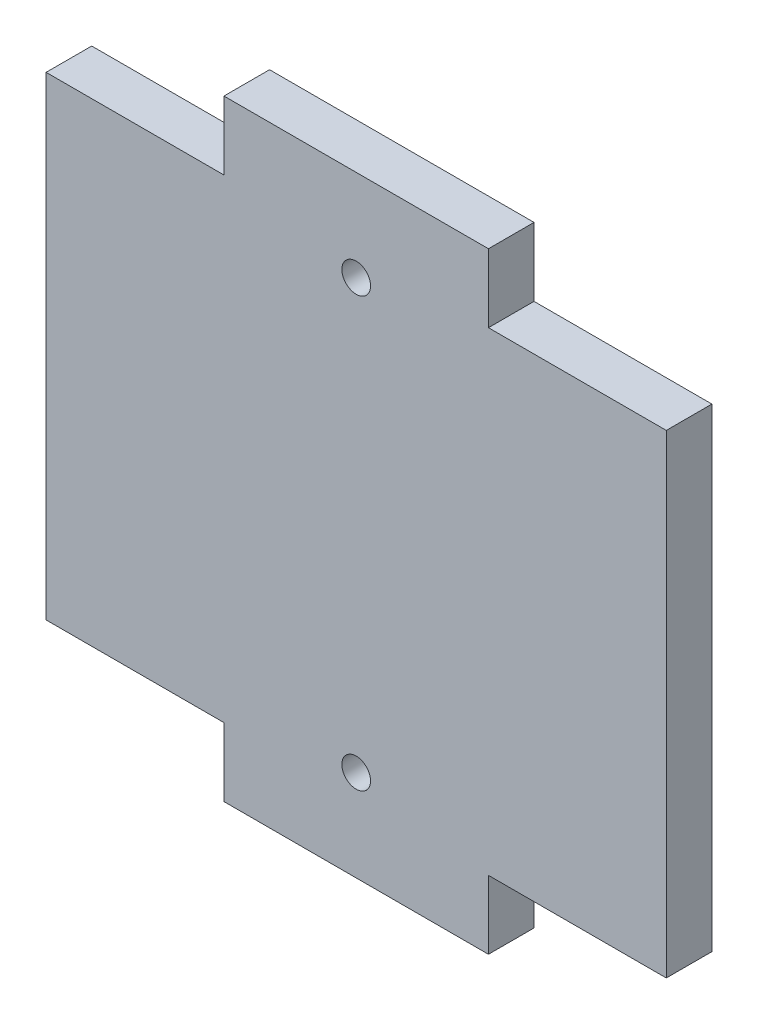
ISO-10303-21;
HEADER;
FILE_DESCRIPTION(('STEP AP214'),'2;1');
FILE_NAME('part.step','',(''),(''),'','','');
FILE_SCHEMA(('AUTOMOTIVE_DESIGN { 1 0 10303 214 1 1 1 1 }'));
ENDSEC;
DATA;
#1=APPLICATION_CONTEXT('core data for automotive mechanical design processes');
#2=APPLICATION_PROTOCOL_DEFINITION('international standard','automotive_design',2000,#1);
#3=PRODUCT_CONTEXT('',#1,'mechanical');
#4=PRODUCT('Part','Part','',(#3));
#5=PRODUCT_RELATED_PRODUCT_CATEGORY('part','',(#4));
#6=PRODUCT_DEFINITION_FORMATION('','',#4);
#7=PRODUCT_DEFINITION_CONTEXT('part definition',#1,'design');
#8=PRODUCT_DEFINITION('design','',#6,#7);
#9=PRODUCT_DEFINITION_SHAPE('','',#8);
#10=(LENGTH_UNIT() NAMED_UNIT(*) SI_UNIT(.MILLI.,.METRE.));
#11=(NAMED_UNIT(*) PLANE_ANGLE_UNIT() SI_UNIT($,.RADIAN.));
#12=(NAMED_UNIT(*) SI_UNIT($,.STERADIAN.) SOLID_ANGLE_UNIT());
#13=UNCERTAINTY_MEASURE_WITH_UNIT(LENGTH_MEASURE(1.E-05),#10,'distance_accuracy_value','');
#14=(GEOMETRIC_REPRESENTATION_CONTEXT(3) GLOBAL_UNCERTAINTY_ASSIGNED_CONTEXT((#13)) GLOBAL_UNIT_ASSIGNED_CONTEXT((#10,
#11,#12)) REPRESENTATION_CONTEXT('',''));
#15=CARTESIAN_POINT('',(0.,0.,0.));
#16=DIRECTION('',(0.,0.,1.));
#17=DIRECTION('',(1.,0.,0.));
#18=AXIS2_PLACEMENT_3D('',#15,#16,#17);
#19=CARTESIAN_POINT('',(-10.795,0.,1.5875));
#20=DIRECTION('',(-1.,0.,0.));
#21=DIRECTION('',(0.,0.,1.));
#22=AXIS2_PLACEMENT_3D('',#19,#20,#21);
#23=PLANE('',#22);
#24=DIRECTION('',(0.,1.,0.));
#25=VECTOR('',#24,1.);
#26=CARTESIAN_POINT('',(-10.795,0.,0.));
#27=LINE('',#26,#25);
#28=CARTESIAN_POINT('',(-10.795,-8.255,0.));
#29=VERTEX_POINT('',#28);
#30=CARTESIAN_POINT('',(-10.795,8.255,0.));
#31=VERTEX_POINT('',#30);
#32=EDGE_CURVE('E195',#29,#31,#27,.T.);
#33=ORIENTED_EDGE('',*,*,#32,.F.);
#34=DIRECTION('',(0.,0.,-1.));
#35=VECTOR('',#34,1.);
#36=CARTESIAN_POINT('',(-10.795,-8.255,1.5875));
#37=LINE('',#36,#35);
#38=CARTESIAN_POINT('',(-10.795,-8.255,1.5875));
#39=VERTEX_POINT('',#38);
#40=EDGE_CURVE('E11',#39,#29,#37,.T.);
#41=ORIENTED_EDGE('',*,*,#40,.F.);
#42=DIRECTION('',(0.,1.,0.));
#43=VECTOR('',#42,1.);
#44=CARTESIAN_POINT('',(-10.795,0.,1.5875));
#45=LINE('',#44,#43);
#46=CARTESIAN_POINT('',(-10.795,8.255,1.5875));
#47=VERTEX_POINT('',#46);
#48=EDGE_CURVE('E202',#39,#47,#45,.T.);
#49=ORIENTED_EDGE('',*,*,#48,.T.);
#50=DIRECTION('',(0.,0.,-1.));
#51=VECTOR('',#50,1.);
#52=CARTESIAN_POINT('',(-10.795,8.255,1.5875));
#53=LINE('',#52,#51);
#54=EDGE_CURVE('E248',#47,#31,#53,.T.);
#55=ORIENTED_EDGE('',*,*,#54,.T.);
#56=EDGE_LOOP('',(#33,#41,#49,#55));
#57=FACE_BOUND('',#56,.T.);
#58=ADVANCED_FACE('F41',(#57),#23,.T.);
#59=CARTESIAN_POINT('',(0.,-8.255,1.5875));
#60=DIRECTION('',(0.,-1.,0.));
#61=DIRECTION('',(0.,0.,-1.));
#62=AXIS2_PLACEMENT_3D('',#59,#60,#61);
#63=PLANE('',#62);
#64=DIRECTION('',(-1.,0.,0.));
#65=VECTOR('',#64,1.);
#66=CARTESIAN_POINT('',(0.,-8.255,0.));
#67=LINE('',#66,#65);
#68=CARTESIAN_POINT('',(-4.60375,-8.255,0.));
#69=VERTEX_POINT('',#68);
#70=EDGE_CURVE('E252',#69,#29,#67,.T.);
#71=ORIENTED_EDGE('',*,*,#70,.F.);
#72=DIRECTION('',(0.,0.,-1.));
#73=VECTOR('',#72,1.);
#74=CARTESIAN_POINT('',(-4.60375,-8.255,1.5875));
#75=LINE('',#74,#73);
#76=CARTESIAN_POINT('',(-4.60375,-8.255,1.5875));
#77=VERTEX_POINT('',#76);
#78=EDGE_CURVE('E49',#77,#69,#75,.T.);
#79=ORIENTED_EDGE('',*,*,#78,.F.);
#80=DIRECTION('',(-1.,0.,0.));
#81=VECTOR('',#80,1.);
#82=CARTESIAN_POINT('',(0.,-8.255,1.5875));
#83=LINE('',#82,#81);
#84=EDGE_CURVE('E206',#77,#39,#83,.T.);
#85=ORIENTED_EDGE('',*,*,#84,.T.);
#86=ORIENTED_EDGE('',*,*,#40,.T.);
#87=EDGE_LOOP('',(#71,#79,#85,#86));
#88=FACE_BOUND('',#87,.T.);
#89=ADVANCED_FACE('F338',(#88),#63,.T.);
#90=CARTESIAN_POINT('',(-4.60375,0.,1.5875));
#91=DIRECTION('',(1.,0.,0.));
#92=DIRECTION('',(0.,0.,-1.));
#93=AXIS2_PLACEMENT_3D('',#90,#91,#92);
#94=PLANE('',#93);
#95=DIRECTION('',(0.,-1.,0.));
#96=VECTOR('',#95,1.);
#97=CARTESIAN_POINT('',(-4.60375,0.,0.));
#98=LINE('',#97,#96);
#99=CARTESIAN_POINT('',(-4.60375,-10.63625,0.));
#100=VERTEX_POINT('',#99);
#101=EDGE_CURVE('E256',#69,#100,#98,.T.);
#102=ORIENTED_EDGE('',*,*,#101,.T.);
#103=DIRECTION('',(0.,0.,-1.));
#104=VECTOR('',#103,1.);
#105=CARTESIAN_POINT('',(-4.60375,-10.63625,1.5875));
#106=LINE('',#105,#104);
#107=CARTESIAN_POINT('',(-4.60375,-10.63625,1.5875));
#108=VERTEX_POINT('',#107);
#109=EDGE_CURVE('E322',#108,#100,#106,.T.);
#110=ORIENTED_EDGE('',*,*,#109,.F.);
#111=DIRECTION('',(0.,-1.,0.));
#112=VECTOR('',#111,1.);
#113=CARTESIAN_POINT('',(-4.60375,0.,1.5875));
#114=LINE('',#113,#112);
#115=EDGE_CURVE('E211',#77,#108,#114,.T.);
#116=ORIENTED_EDGE('',*,*,#115,.F.);
#117=ORIENTED_EDGE('',*,*,#78,.T.);
#118=EDGE_LOOP('',(#102,#110,#116,#117));
#119=FACE_BOUND('',#118,.T.);
#120=ADVANCED_FACE('F329',(#119),#94,.F.);
#121=CARTESIAN_POINT('',(0.,-10.63625,1.5875));
#122=DIRECTION('',(0.,1.,0.));
#123=DIRECTION('',(0.,0.,1.));
#124=AXIS2_PLACEMENT_3D('',#121,#122,#123);
#125=PLANE('',#124);
#126=DIRECTION('',(1.,0.,0.));
#127=VECTOR('',#126,1.);
#128=CARTESIAN_POINT('',(0.,-10.63625,0.));
#129=LINE('',#128,#127);
#130=CARTESIAN_POINT('',(4.60375,-10.63625,0.));
#131=VERTEX_POINT('',#130);
#132=EDGE_CURVE('E260',#100,#131,#129,.T.);
#133=ORIENTED_EDGE('',*,*,#132,.T.);
#134=DIRECTION('',(0.,0.,-1.));
#135=VECTOR('',#134,1.);
#136=CARTESIAN_POINT('',(4.60375,-10.63625,1.5875));
#137=LINE('',#136,#135);
#138=CARTESIAN_POINT('',(4.60375,-10.63625,1.5875));
#139=VERTEX_POINT('',#138);
#140=EDGE_CURVE('E319',#139,#131,#137,.T.);
#141=ORIENTED_EDGE('',*,*,#140,.F.);
#142=DIRECTION('',(1.,0.,0.));
#143=VECTOR('',#142,1.);
#144=CARTESIAN_POINT('',(0.,-10.63625,1.5875));
#145=LINE('',#144,#143);
#146=EDGE_CURVE('E215',#108,#139,#145,.T.);
#147=ORIENTED_EDGE('',*,*,#146,.F.);
#148=ORIENTED_EDGE('',*,*,#109,.T.);
#149=EDGE_LOOP('',(#133,#141,#147,#148));
#150=FACE_BOUND('',#149,.T.);
#151=ADVANCED_FACE('F407',(#150),#125,.F.);
#152=CARTESIAN_POINT('',(4.60375,0.,1.5875));
#153=DIRECTION('',(1.,0.,0.));
#154=DIRECTION('',(0.,0.,-1.));
#155=AXIS2_PLACEMENT_3D('',#152,#153,#154);
#156=PLANE('',#155);
#157=DIRECTION('',(0.,-1.,0.));
#158=VECTOR('',#157,1.);
#159=CARTESIAN_POINT('',(4.60375,0.,0.));
#160=LINE('',#159,#158);
#161=CARTESIAN_POINT('',(4.60375,-8.255,0.));
#162=VERTEX_POINT('',#161);
#163=EDGE_CURVE('E264',#162,#131,#160,.T.);
#164=ORIENTED_EDGE('',*,*,#163,.F.);
#165=DIRECTION('',(0.,0.,-1.));
#166=VECTOR('',#165,1.);
#167=CARTESIAN_POINT('',(4.60375,-8.255,1.5875));
#168=LINE('',#167,#166);
#169=CARTESIAN_POINT('',(4.60375,-8.255,1.5875));
#170=VERTEX_POINT('',#169);
#171=EDGE_CURVE('E316',#170,#162,#168,.T.);
#172=ORIENTED_EDGE('',*,*,#171,.F.);
#173=DIRECTION('',(0.,-1.,0.));
#174=VECTOR('',#173,1.);
#175=CARTESIAN_POINT('',(4.60375,0.,1.5875));
#176=LINE('',#175,#174);
#177=EDGE_CURVE('E218',#170,#139,#176,.T.);
#178=ORIENTED_EDGE('',*,*,#177,.T.);
#179=ORIENTED_EDGE('',*,*,#140,.T.);
#180=EDGE_LOOP('',(#164,#172,#178,#179));
#181=FACE_BOUND('',#180,.T.);
#182=ADVANCED_FACE('F411',(#181),#156,.T.);
#183=CARTESIAN_POINT('',(10.795,-8.255,0.));
#184=VERTEX_POINT('',#183);
#185=EDGE_CURVE('E257',#184,#162,#67,.T.);
#186=ORIENTED_EDGE('',*,*,#185,.F.);
#187=DIRECTION('',(0.,0.,-1.));
#188=VECTOR('',#187,1.);
#189=CARTESIAN_POINT('',(10.795,-8.255,1.5875));
#190=LINE('',#189,#188);
#191=CARTESIAN_POINT('',(10.795,-8.255,1.5875));
#192=VERTEX_POINT('',#191);
#193=EDGE_CURVE('E313',#192,#184,#190,.T.);
#194=ORIENTED_EDGE('',*,*,#193,.F.);
#195=EDGE_CURVE('E212',#192,#170,#83,.T.);
#196=ORIENTED_EDGE('',*,*,#195,.T.);
#197=ORIENTED_EDGE('',*,*,#171,.T.);
#198=EDGE_LOOP('',(#186,#194,#196,#197));
#199=FACE_BOUND('',#198,.T.);
#200=ADVANCED_FACE('F375',(#199),#63,.T.);
#201=CARTESIAN_POINT('',(10.795,0.,1.5875));
#202=DIRECTION('',(-1.,0.,0.));
#203=DIRECTION('',(0.,0.,1.));
#204=AXIS2_PLACEMENT_3D('',#201,#202,#203);
#205=PLANE('',#204);
#206=DIRECTION('',(0.,1.,0.));
#207=VECTOR('',#206,1.);
#208=CARTESIAN_POINT('',(10.795,0.,0.));
#209=LINE('',#208,#207);
#210=CARTESIAN_POINT('',(10.795,8.255,0.));
#211=VERTEX_POINT('',#210);
#212=EDGE_CURVE('E268',#184,#211,#209,.T.);
#213=ORIENTED_EDGE('',*,*,#212,.T.);
#214=DIRECTION('',(0.,0.,-1.));
#215=VECTOR('',#214,1.);
#216=CARTESIAN_POINT('',(10.795,8.255,1.5875));
#217=LINE('',#216,#215);
#218=CARTESIAN_POINT('',(10.795,8.255,1.5875));
#219=VERTEX_POINT('',#218);
#220=EDGE_CURVE('E309',#219,#211,#217,.T.);
#221=ORIENTED_EDGE('',*,*,#220,.F.);
#222=DIRECTION('',(0.,1.,0.));
#223=VECTOR('',#222,1.);
#224=CARTESIAN_POINT('',(10.795,0.,1.5875));
#225=LINE('',#224,#223);
#226=EDGE_CURVE('E222',#192,#219,#225,.T.);
#227=ORIENTED_EDGE('',*,*,#226,.F.);
#228=ORIENTED_EDGE('',*,*,#193,.T.);
#229=EDGE_LOOP('',(#213,#221,#227,#228));
#230=FACE_BOUND('',#229,.T.);
#231=ADVANCED_FACE('F370',(#230),#205,.F.);
#232=CARTESIAN_POINT('',(0.,8.255,1.5875));
#233=DIRECTION('',(0.,-1.,0.));
#234=DIRECTION('',(0.,0.,-1.));
#235=AXIS2_PLACEMENT_3D('',#232,#233,#234);
#236=PLANE('',#235);
#237=DIRECTION('',(-1.,0.,0.));
#238=VECTOR('',#237,1.);
#239=CARTESIAN_POINT('',(0.,8.255,0.));
#240=LINE('',#239,#238);
#241=CARTESIAN_POINT('',(4.60375,8.255,0.));
#242=VERTEX_POINT('',#241);
#243=EDGE_CURVE('E271',#211,#242,#240,.T.);
#244=ORIENTED_EDGE('',*,*,#243,.T.);
#245=DIRECTION('',(0.,0.,-1.));
#246=VECTOR('',#245,1.);
#247=CARTESIAN_POINT('',(4.60375,8.255,1.5875));
#248=LINE('',#247,#246);
#249=CARTESIAN_POINT('',(4.60375,8.255,1.5875));
#250=VERTEX_POINT('',#249);
#251=EDGE_CURVE('E305',#250,#242,#248,.T.);
#252=ORIENTED_EDGE('',*,*,#251,.F.);
#253=DIRECTION('',(-1.,0.,0.));
#254=VECTOR('',#253,1.);
#255=CARTESIAN_POINT('',(0.,8.255,1.5875));
#256=LINE('',#255,#254);
#257=EDGE_CURVE('E225',#219,#250,#256,.T.);
#258=ORIENTED_EDGE('',*,*,#257,.F.);
#259=ORIENTED_EDGE('',*,*,#220,.T.);
#260=EDGE_LOOP('',(#244,#252,#258,#259));
#261=FACE_BOUND('',#260,.T.);
#262=ADVANCED_FACE('F366',(#261),#236,.F.);
#263=CARTESIAN_POINT('',(4.60375,0.,1.5875));
#264=DIRECTION('',(-1.,0.,0.));
#265=DIRECTION('',(0.,0.,1.));
#266=AXIS2_PLACEMENT_3D('',#263,#264,#265);
#267=PLANE('',#266);
#268=DIRECTION('',(0.,1.,0.));
#269=VECTOR('',#268,1.);
#270=CARTESIAN_POINT('',(4.60375,0.,0.));
#271=LINE('',#270,#269);
#272=CARTESIAN_POINT('',(4.60375,10.63625,0.));
#273=VERTEX_POINT('',#272);
#274=EDGE_CURVE('E274',#242,#273,#271,.T.);
#275=ORIENTED_EDGE('',*,*,#274,.T.);
#276=DIRECTION('',(0.,0.,-1.));
#277=VECTOR('',#276,1.);
#278=CARTESIAN_POINT('',(4.60375,10.63625,1.5875));
#279=LINE('',#278,#277);
#280=CARTESIAN_POINT('',(4.60375,10.63625,1.5875));
#281=VERTEX_POINT('',#280);
#282=EDGE_CURVE('E302',#281,#273,#279,.T.);
#283=ORIENTED_EDGE('',*,*,#282,.F.);
#284=DIRECTION('',(0.,1.,0.));
#285=VECTOR('',#284,1.);
#286=CARTESIAN_POINT('',(4.60375,0.,1.5875));
#287=LINE('',#286,#285);
#288=EDGE_CURVE('E228',#250,#281,#287,.T.);
#289=ORIENTED_EDGE('',*,*,#288,.F.);
#290=ORIENTED_EDGE('',*,*,#251,.T.);
#291=EDGE_LOOP('',(#275,#283,#289,#290));
#292=FACE_BOUND('',#291,.T.);
#293=ADVANCED_FACE('F361',(#292),#267,.F.);
#294=CARTESIAN_POINT('',(0.,10.63625,1.5875));
#295=DIRECTION('',(0.,1.,0.));
#296=DIRECTION('',(0.,0.,1.));
#297=AXIS2_PLACEMENT_3D('',#294,#295,#296);
#298=PLANE('',#297);
#299=DIRECTION('',(1.,0.,0.));
#300=VECTOR('',#299,1.);
#301=CARTESIAN_POINT('',(0.,10.63625,0.));
#302=LINE('',#301,#300);
#303=CARTESIAN_POINT('',(-4.60375,10.63625,0.));
#304=VERTEX_POINT('',#303);
#305=EDGE_CURVE('E279',#304,#273,#302,.T.);
#306=ORIENTED_EDGE('',*,*,#305,.F.);
#307=DIRECTION('',(0.,0.,-1.));
#308=VECTOR('',#307,1.);
#309=CARTESIAN_POINT('',(-4.60375,10.63625,1.5875));
#310=LINE('',#309,#308);
#311=CARTESIAN_POINT('',(-4.60375,10.63625,1.5875));
#312=VERTEX_POINT('',#311);
#313=EDGE_CURVE('E299',#312,#304,#310,.T.);
#314=ORIENTED_EDGE('',*,*,#313,.F.);
#315=DIRECTION('',(1.,0.,0.));
#316=VECTOR('',#315,1.);
#317=CARTESIAN_POINT('',(0.,10.63625,1.5875));
#318=LINE('',#317,#316);
#319=EDGE_CURVE('E232',#312,#281,#318,.T.);
#320=ORIENTED_EDGE('',*,*,#319,.T.);
#321=ORIENTED_EDGE('',*,*,#282,.T.);
#322=EDGE_LOOP('',(#306,#314,#320,#321));
#323=FACE_BOUND('',#322,.T.);
#324=ADVANCED_FACE('F355',(#323),#298,.T.);
#325=CARTESIAN_POINT('',(-4.60375,0.,1.5875));
#326=DIRECTION('',(-1.,0.,0.));
#327=DIRECTION('',(0.,0.,1.));
#328=AXIS2_PLACEMENT_3D('',#325,#326,#327);
#329=PLANE('',#328);
#330=DIRECTION('',(0.,1.,0.));
#331=VECTOR('',#330,1.);
#332=CARTESIAN_POINT('',(-4.60375,0.,0.));
#333=LINE('',#332,#331);
#334=CARTESIAN_POINT('',(-4.60375,8.255,0.));
#335=VERTEX_POINT('',#334);
#336=EDGE_CURVE('E283',#335,#304,#333,.T.);
#337=ORIENTED_EDGE('',*,*,#336,.F.);
#338=DIRECTION('',(0.,0.,-1.));
#339=VECTOR('',#338,1.);
#340=CARTESIAN_POINT('',(-4.60375,8.255,1.5875));
#341=LINE('',#340,#339);
#342=CARTESIAN_POINT('',(-4.60375,8.255,1.5875));
#343=VERTEX_POINT('',#342);
#344=EDGE_CURVE('E296',#343,#335,#341,.T.);
#345=ORIENTED_EDGE('',*,*,#344,.F.);
#346=DIRECTION('',(0.,1.,0.));
#347=VECTOR('',#346,1.);
#348=CARTESIAN_POINT('',(-4.60375,0.,1.5875));
#349=LINE('',#348,#347);
#350=EDGE_CURVE('E236',#343,#312,#349,.T.);
#351=ORIENTED_EDGE('',*,*,#350,.T.);
#352=ORIENTED_EDGE('',*,*,#313,.T.);
#353=EDGE_LOOP('',(#337,#345,#351,#352));
#354=FACE_BOUND('',#353,.T.);
#355=ADVANCED_FACE('F349',(#354),#329,.T.);
#356=CARTESIAN_POINT('',(0.,7.46125,1.5875));
#357=DIRECTION('',(0.,0.,-1.));
#358=DIRECTION('',(-1.,0.,0.));
#359=AXIS2_PLACEMENT_3D('',#356,#357,#358);
#360=CYLINDRICAL_SURFACE('',#359,0.5);
#361=CARTESIAN_POINT('',(0.,7.46125,1.5875));
#362=DIRECTION('',(0.,0.,1.));
#363=DIRECTION('',(1.,0.,0.));
#364=AXIS2_PLACEMENT_3D('',#361,#362,#363);
#365=CIRCLE('',#364,0.5);
#366=CARTESIAN_POINT('',(0.5,7.46125,1.5875));
#367=VERTEX_POINT('',#366);
#368=EDGE_CURVE('E240',#367,#367,#365,.T.);
#369=ORIENTED_EDGE('',*,*,#368,.T.);
#370=EDGE_LOOP('',(#369));
#371=FACE_BOUND('',#370,.T.);
#372=CARTESIAN_POINT('',(0.,7.46125,0.));
#373=DIRECTION('',(0.,0.,1.));
#374=DIRECTION('',(1.,0.,0.));
#375=AXIS2_PLACEMENT_3D('',#372,#373,#374);
#376=CIRCLE('',#375,0.5);
#377=CARTESIAN_POINT('',(0.5,7.46125,0.));
#378=VERTEX_POINT('',#377);
#379=EDGE_CURVE('E287',#378,#378,#376,.T.);
#380=ORIENTED_EDGE('',*,*,#379,.F.);
#381=EDGE_LOOP('',(#380));
#382=FACE_BOUND('',#381,.T.);
#383=ADVANCED_FACE('F387',(#371,#382),#360,.F.);
#384=EDGE_CURVE('E275',#335,#31,#240,.T.);
#385=ORIENTED_EDGE('',*,*,#384,.T.);
#386=ORIENTED_EDGE('',*,*,#54,.F.);
#387=EDGE_CURVE('E229',#343,#47,#256,.T.);
#388=ORIENTED_EDGE('',*,*,#387,.F.);
#389=ORIENTED_EDGE('',*,*,#344,.T.);
#390=EDGE_LOOP('',(#385,#386,#388,#389));
#391=FACE_BOUND('',#390,.T.);
#392=ADVANCED_FACE('F384',(#391),#236,.F.);
#393=CARTESIAN_POINT('',(0.,-7.46125,1.5875));
#394=DIRECTION('',(0.,0.,-1.));
#395=DIRECTION('',(-1.,0.,0.));
#396=AXIS2_PLACEMENT_3D('',#393,#394,#395);
#397=CYLINDRICAL_SURFACE('',#396,0.5);
#398=CARTESIAN_POINT('',(0.,-7.46125,1.5875));
#399=DIRECTION('',(0.,0.,1.));
#400=DIRECTION('',(1.,0.,0.));
#401=AXIS2_PLACEMENT_3D('',#398,#399,#400);
#402=CIRCLE('',#401,0.5);
#403=CARTESIAN_POINT('',(0.499999999999998,-7.46125,1.5875));
#404=VERTEX_POINT('',#403);
#405=EDGE_CURVE('E244',#404,#404,#402,.F.);
#406=ORIENTED_EDGE('',*,*,#405,.F.);
#407=EDGE_LOOP('',(#406));
#408=FACE_BOUND('',#407,.T.);
#409=CARTESIAN_POINT('',(0.,-7.46125,0.));
#410=DIRECTION('',(0.,0.,1.));
#411=DIRECTION('',(1.,0.,0.));
#412=AXIS2_PLACEMENT_3D('',#409,#410,#411);
#413=CIRCLE('',#412,0.5);
#414=CARTESIAN_POINT('',(0.499999999999998,-7.46125,0.));
#415=VERTEX_POINT('',#414);
#416=EDGE_CURVE('E207',#415,#415,#413,.F.);
#417=ORIENTED_EDGE('',*,*,#416,.T.);
#418=EDGE_LOOP('',(#417));
#419=FACE_BOUND('',#418,.T.);
#420=ADVANCED_FACE('F386',(#408,#419),#397,.F.);
#421=CARTESIAN_POINT('',(0.,0.,1.5875));
#422=DIRECTION('',(0.,0.,1.));
#423=DIRECTION('',(1.,0.,0.));
#424=AXIS2_PLACEMENT_3D('',#421,#422,#423);
#425=PLANE('',#424);
#426=ORIENTED_EDGE('',*,*,#48,.F.);
#427=ORIENTED_EDGE('',*,*,#84,.F.);
#428=ORIENTED_EDGE('',*,*,#115,.T.);
#429=ORIENTED_EDGE('',*,*,#146,.T.);
#430=ORIENTED_EDGE('',*,*,#177,.F.);
#431=ORIENTED_EDGE('',*,*,#195,.F.);
#432=ORIENTED_EDGE('',*,*,#226,.T.);
#433=ORIENTED_EDGE('',*,*,#257,.T.);
#434=ORIENTED_EDGE('',*,*,#288,.T.);
#435=ORIENTED_EDGE('',*,*,#319,.F.);
#436=ORIENTED_EDGE('',*,*,#350,.F.);
#437=ORIENTED_EDGE('',*,*,#387,.T.);
#438=EDGE_LOOP('',(#426,#427,#428,#429,#430,#431,#432,#433,#434,#435,#436,#437));
#439=FACE_BOUND('',#438,.T.);
#440=ORIENTED_EDGE('',*,*,#368,.F.);
#441=EDGE_LOOP('',(#440));
#442=FACE_BOUND('',#441,.T.);
#443=ORIENTED_EDGE('',*,*,#405,.T.);
#444=EDGE_LOOP('',(#443));
#445=FACE_BOUND('',#444,.T.);
#446=ADVANCED_FACE('F382',(#439,#442,#445),#425,.T.);
#447=CARTESIAN_POINT('',(0.,0.,0.));
#448=DIRECTION('',(0.,0.,1.));
#449=DIRECTION('',(1.,0.,0.));
#450=AXIS2_PLACEMENT_3D('',#447,#448,#449);
#451=PLANE('',#450);
#452=DIRECTION('',(-1.,0.,0.));
#453=VECTOR('',#452,1.);
#454=CARTESIAN_POINT('',(7.62,-5.08,0.));
#455=LINE('',#454,#453);
#456=CARTESIAN_POINT('',(7.62,-5.08,0.));
#457=VERTEX_POINT('',#456);
#458=CARTESIAN_POINT('',(-7.62,-5.08,0.));
#459=VERTEX_POINT('',#458);
#460=EDGE_CURVE('E175',#457,#459,#455,.T.);
#461=ORIENTED_EDGE('',*,*,#460,.F.);
#462=DIRECTION('',(0.,1.,0.));
#463=VECTOR('',#462,1.);
#464=CARTESIAN_POINT('',(7.62,-5.08,0.));
#465=LINE('',#464,#463);
#466=CARTESIAN_POINT('',(7.62,5.08,0.));
#467=VERTEX_POINT('',#466);
#468=EDGE_CURVE('E56',#457,#467,#465,.T.);
#469=ORIENTED_EDGE('',*,*,#468,.T.);
#470=DIRECTION('',(-1.,0.,0.));
#471=VECTOR('',#470,1.);
#472=CARTESIAN_POINT('',(7.62,5.08,0.));
#473=LINE('',#472,#471);
#474=CARTESIAN_POINT('',(-7.62,5.08,0.));
#475=VERTEX_POINT('',#474);
#476=EDGE_CURVE('E61',#467,#475,#473,.T.);
#477=ORIENTED_EDGE('',*,*,#476,.T.);
#478=DIRECTION('',(0.,1.,0.));
#479=VECTOR('',#478,1.);
#480=CARTESIAN_POINT('',(-7.62,-5.08,0.));
#481=LINE('',#480,#479);
#482=EDGE_CURVE('E179',#459,#475,#481,.T.);
#483=ORIENTED_EDGE('',*,*,#482,.F.);
#484=EDGE_LOOP('',(#461,#469,#477,#483));
#485=FACE_BOUND('',#484,.T.);
#486=ORIENTED_EDGE('',*,*,#32,.T.);
#487=ORIENTED_EDGE('',*,*,#384,.F.);
#488=ORIENTED_EDGE('',*,*,#336,.T.);
#489=ORIENTED_EDGE('',*,*,#305,.T.);
#490=ORIENTED_EDGE('',*,*,#274,.F.);
#491=ORIENTED_EDGE('',*,*,#243,.F.);
#492=ORIENTED_EDGE('',*,*,#212,.F.);
#493=ORIENTED_EDGE('',*,*,#185,.T.);
#494=ORIENTED_EDGE('',*,*,#163,.T.);
#495=ORIENTED_EDGE('',*,*,#132,.F.);
#496=ORIENTED_EDGE('',*,*,#101,.F.);
#497=ORIENTED_EDGE('',*,*,#70,.T.);
#498=EDGE_LOOP('',(#486,#487,#488,#489,#490,#491,#492,#493,#494,#495,#496,#497));
#499=FACE_BOUND('',#498,.T.);
#500=ORIENTED_EDGE('',*,*,#379,.T.);
#501=EDGE_LOOP('',(#500));
#502=FACE_BOUND('',#501,.T.);
#503=ORIENTED_EDGE('',*,*,#416,.F.);
#504=EDGE_LOOP('',(#503));
#505=FACE_BOUND('',#504,.T.);
#506=ADVANCED_FACE('F336',(#485,#499,#502,#505),#451,.F.);
#507=CARTESIAN_POINT('',(7.62,-5.08,-3.175));
#508=DIRECTION('',(1.,0.,0.));
#509=DIRECTION('',(0.,0.,-1.));
#510=AXIS2_PLACEMENT_3D('',#507,#508,#509);
#511=PLANE('',#510);
#512=ORIENTED_EDGE('',*,*,#468,.F.);
#513=DIRECTION('',(0.,0.,1.));
#514=VECTOR('',#513,1.);
#515=CARTESIAN_POINT('',(7.62,-5.08,-3.175));
#516=LINE('',#515,#514);
#517=CARTESIAN_POINT('',(7.62,-5.08,-3.175));
#518=VERTEX_POINT('',#517);
#519=EDGE_CURVE('E172',#518,#457,#516,.T.);
#520=ORIENTED_EDGE('',*,*,#519,.F.);
#521=DIRECTION('',(0.,1.,0.));
#522=VECTOR('',#521,1.);
#523=CARTESIAN_POINT('',(7.62,-5.08,-3.175));
#524=LINE('',#523,#522);
#525=CARTESIAN_POINT('',(7.62,5.08,-3.175));
#526=VERTEX_POINT('',#525);
#527=EDGE_CURVE('E164',#518,#526,#524,.T.);
#528=ORIENTED_EDGE('',*,*,#527,.T.);
#529=DIRECTION('',(0.,0.,1.));
#530=VECTOR('',#529,1.);
#531=CARTESIAN_POINT('',(7.62,5.08,-3.175));
#532=LINE('',#531,#530);
#533=EDGE_CURVE('E151',#526,#467,#532,.T.);
#534=ORIENTED_EDGE('',*,*,#533,.T.);
#535=EDGE_LOOP('',(#512,#520,#528,#534));
#536=FACE_BOUND('',#535,.T.);
#537=ADVANCED_FACE('F170',(#536),#511,.T.);
#538=CARTESIAN_POINT('',(7.62,-5.08,-3.175));
#539=DIRECTION('',(0.,1.,0.));
#540=DIRECTION('',(-1.,0.,0.));
#541=AXIS2_PLACEMENT_3D('',#538,#539,#540);
#542=PLANE('',#541);
#543=ORIENTED_EDGE('',*,*,#460,.T.);
#544=DIRECTION('',(0.,0.,1.));
#545=VECTOR('',#544,1.);
#546=CARTESIAN_POINT('',(-7.62,-5.08,-3.175));
#547=LINE('',#546,#545);
#548=CARTESIAN_POINT('',(-7.62,-5.08,-3.175));
#549=VERTEX_POINT('',#548);
#550=EDGE_CURVE('E196',#549,#459,#547,.T.);
#551=ORIENTED_EDGE('',*,*,#550,.F.);
#552=DIRECTION('',(-1.,0.,0.));
#553=VECTOR('',#552,1.);
#554=CARTESIAN_POINT('',(7.62,-5.08,-3.175));
#555=LINE('',#554,#553);
#556=EDGE_CURVE('E159',#518,#549,#555,.T.);
#557=ORIENTED_EDGE('',*,*,#556,.F.);
#558=ORIENTED_EDGE('',*,*,#519,.T.);
#559=EDGE_LOOP('',(#543,#551,#557,#558));
#560=FACE_BOUND('',#559,.T.);
#561=ADVANCED_FACE('F541',(#560),#542,.F.);
#562=CARTESIAN_POINT('',(-7.62,-5.08,-3.175));
#563=DIRECTION('',(1.,0.,0.));
#564=DIRECTION('',(0.,0.,-1.));
#565=AXIS2_PLACEMENT_3D('',#562,#563,#564);
#566=PLANE('',#565);
#567=ORIENTED_EDGE('',*,*,#482,.T.);
#568=DIRECTION('',(0.,0.,1.));
#569=VECTOR('',#568,1.);
#570=CARTESIAN_POINT('',(-7.62,5.08,-3.175));
#571=LINE('',#570,#569);
#572=CARTESIAN_POINT('',(-7.62,5.08,-3.175));
#573=VERTEX_POINT('',#572);
#574=EDGE_CURVE('E158',#573,#475,#571,.T.);
#575=ORIENTED_EDGE('',*,*,#574,.F.);
#576=DIRECTION('',(0.,1.,0.));
#577=VECTOR('',#576,1.);
#578=CARTESIAN_POINT('',(-7.62,-5.08,-3.175));
#579=LINE('',#578,#577);
#580=EDGE_CURVE('E166',#549,#573,#579,.T.);
#581=ORIENTED_EDGE('',*,*,#580,.F.);
#582=ORIENTED_EDGE('',*,*,#550,.T.);
#583=EDGE_LOOP('',(#567,#575,#581,#582));
#584=FACE_BOUND('',#583,.T.);
#585=ADVANCED_FACE('F549',(#584),#566,.F.);
#586=CARTESIAN_POINT('',(7.62,5.08,-3.175));
#587=DIRECTION('',(0.,1.,0.));
#588=DIRECTION('',(-1.,0.,0.));
#589=AXIS2_PLACEMENT_3D('',#586,#587,#588);
#590=PLANE('',#589);
#591=ORIENTED_EDGE('',*,*,#476,.F.);
#592=ORIENTED_EDGE('',*,*,#533,.F.);
#593=DIRECTION('',(-1.,0.,0.));
#594=VECTOR('',#593,1.);
#595=CARTESIAN_POINT('',(7.62,5.08,-3.175));
#596=LINE('',#595,#594);
#597=EDGE_CURVE('E154',#526,#573,#596,.T.);
#598=ORIENTED_EDGE('',*,*,#597,.T.);
#599=ORIENTED_EDGE('',*,*,#574,.T.);
#600=EDGE_LOOP('',(#591,#592,#598,#599));
#601=FACE_BOUND('',#600,.T.);
#602=ADVANCED_FACE('F153',(#601),#590,.T.);
#603=CARTESIAN_POINT('',(0.,0.,-3.175));
#604=DIRECTION('',(0.,0.,1.));
#605=DIRECTION('',(1.,0.,0.));
#606=AXIS2_PLACEMENT_3D('',#603,#604,#605);
#607=PLANE('',#606);
#608=ORIENTED_EDGE('',*,*,#527,.F.);
#609=ORIENTED_EDGE('',*,*,#556,.T.);
#610=ORIENTED_EDGE('',*,*,#580,.T.);
#611=ORIENTED_EDGE('',*,*,#597,.F.);
#612=EDGE_LOOP('',(#608,#609,#610,#611));
#613=FACE_BOUND('',#612,.T.);
#614=ADVANCED_FACE('F163',(#613),#607,.F.);
#615=CLOSED_SHELL('',(#58,#89,#120,#151,#182,#200,#231,#262,#293,#324,#355,#383,#392,#420,#446,
#506,#537,#561,#585,#602,#614));
#616=MANIFOLD_SOLID_BREP('B2',#615);
#617=ADVANCED_BREP_SHAPE_REPRESENTATION('',(#18,#616),#14);
#618=SHAPE_DEFINITION_REPRESENTATION(#9,#617);
ENDSEC;
END-ISO-10303-21;
